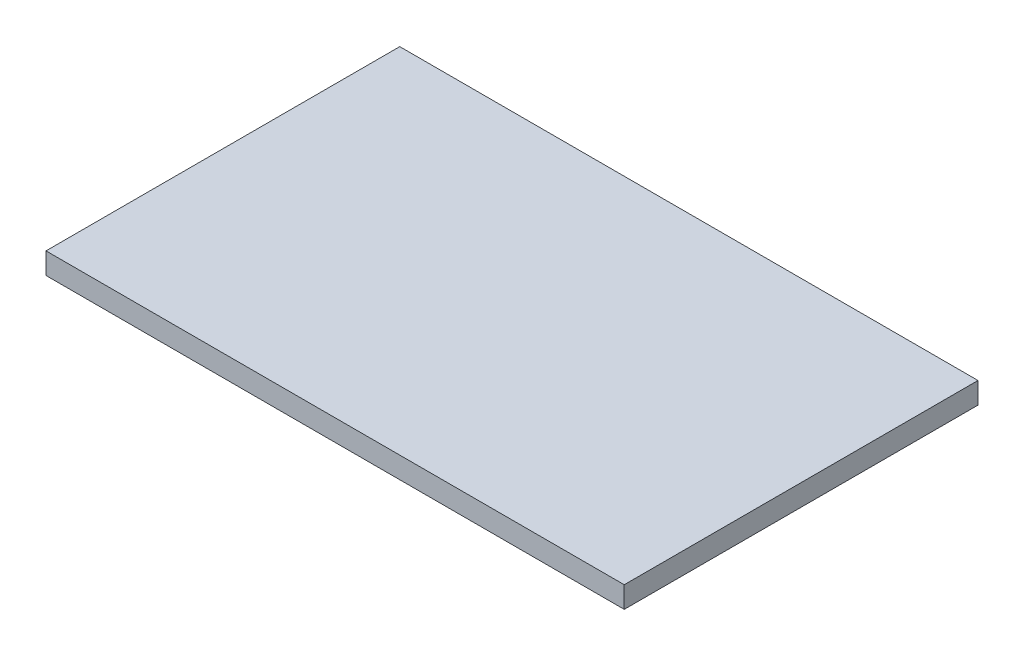
ISO-10303-21;
HEADER;
FILE_DESCRIPTION(('STEP AP214'),'2;1');
FILE_NAME('part.step','',(''),(''),'','','');
FILE_SCHEMA(('AUTOMOTIVE_DESIGN { 1 0 10303 214 1 1 1 1 }'));
ENDSEC;
DATA;
#1=APPLICATION_CONTEXT('core data for automotive mechanical design processes');
#2=APPLICATION_PROTOCOL_DEFINITION('international standard','automotive_design',2000,#1);
#3=PRODUCT_CONTEXT('',#1,'mechanical');
#4=PRODUCT('Part','Part','',(#3));
#5=PRODUCT_RELATED_PRODUCT_CATEGORY('part','',(#4));
#6=PRODUCT_DEFINITION_FORMATION('','',#4);
#7=PRODUCT_DEFINITION_CONTEXT('part definition',#1,'design');
#8=PRODUCT_DEFINITION('design','',#6,#7);
#9=PRODUCT_DEFINITION_SHAPE('','',#8);
#10=(LENGTH_UNIT() NAMED_UNIT(*) SI_UNIT(.MILLI.,.METRE.));
#11=(NAMED_UNIT(*) PLANE_ANGLE_UNIT() SI_UNIT($,.RADIAN.));
#12=(NAMED_UNIT(*) SI_UNIT($,.STERADIAN.) SOLID_ANGLE_UNIT());
#13=UNCERTAINTY_MEASURE_WITH_UNIT(LENGTH_MEASURE(1.E-05),#10,'distance_accuracy_value','');
#14=(GEOMETRIC_REPRESENTATION_CONTEXT(3) GLOBAL_UNCERTAINTY_ASSIGNED_CONTEXT((#13)) GLOBAL_UNIT_ASSIGNED_CONTEXT((#10,
#11,#12)) REPRESENTATION_CONTEXT('',''));
#15=CARTESIAN_POINT('',(0.,0.,0.));
#16=DIRECTION('',(0.,0.,1.));
#17=DIRECTION('',(1.,0.,0.));
#18=AXIS2_PLACEMENT_3D('',#15,#16,#17);
#19=CARTESIAN_POINT('',(-160.886902,11.8872,-98.425));
#20=DIRECTION('',(1.,0.,0.));
#21=DIRECTION('',(0.,0.,-1.));
#22=AXIS2_PLACEMENT_3D('',#19,#20,#21);
#23=PLANE('',#22);
#24=DIRECTION('',(0.,0.,1.));
#25=VECTOR('',#24,1.);
#26=CARTESIAN_POINT('',(-160.886902,0.,-98.425));
#27=LINE('',#26,#25);
#28=CARTESIAN_POINT('',(-160.886902,0.,-98.425));
#29=VERTEX_POINT('',#28);
#30=CARTESIAN_POINT('',(-160.886902,0.,98.425));
#31=VERTEX_POINT('',#30);
#32=EDGE_CURVE('E112',#29,#31,#27,.T.);
#33=ORIENTED_EDGE('',*,*,#32,.T.);
#34=DIRECTION('',(0.,-1.,0.));
#35=VECTOR('',#34,1.);
#36=CARTESIAN_POINT('',(-160.886902,11.8872,98.425));
#37=LINE('',#36,#35);
#38=CARTESIAN_POINT('',(-160.886902,11.8872,98.425));
#39=VERTEX_POINT('',#38);
#40=EDGE_CURVE('E11',#39,#31,#37,.T.);
#41=ORIENTED_EDGE('',*,*,#40,.F.);
#42=DIRECTION('',(0.,0.,1.));
#43=VECTOR('',#42,1.);
#44=CARTESIAN_POINT('',(-160.886902,11.8872,-98.425));
#45=LINE('',#44,#43);
#46=CARTESIAN_POINT('',(-160.886902,11.8872,-98.425));
#47=VERTEX_POINT('',#46);
#48=EDGE_CURVE('E96',#47,#39,#45,.T.);
#49=ORIENTED_EDGE('',*,*,#48,.F.);
#50=DIRECTION('',(0.,-1.,0.));
#51=VECTOR('',#50,1.);
#52=CARTESIAN_POINT('',(-160.886902,11.8872,-98.425));
#53=LINE('',#52,#51);
#54=EDGE_CURVE('E108',#47,#29,#53,.T.);
#55=ORIENTED_EDGE('',*,*,#54,.T.);
#56=EDGE_LOOP('',(#33,#41,#49,#55));
#57=FACE_BOUND('',#56,.T.);
#58=ADVANCED_FACE('F39',(#57),#23,.F.);
#59=CARTESIAN_POINT('',(160.886902,11.8872,98.425));
#60=DIRECTION('',(0.,0.,-1.));
#61=DIRECTION('',(-1.,0.,0.));
#62=AXIS2_PLACEMENT_3D('',#59,#60,#61);
#63=PLANE('',#62);
#64=DIRECTION('',(1.,0.,0.));
#65=VECTOR('',#64,1.);
#66=CARTESIAN_POINT('',(160.886902,0.,98.425));
#67=LINE('',#66,#65);
#68=CARTESIAN_POINT('',(160.886902,0.,98.425));
#69=VERTEX_POINT('',#68);
#70=EDGE_CURVE('E101',#31,#69,#67,.T.);
#71=ORIENTED_EDGE('',*,*,#70,.T.);
#72=DIRECTION('',(0.,-1.,0.));
#73=VECTOR('',#72,1.);
#74=CARTESIAN_POINT('',(160.886902,11.8872,98.425));
#75=LINE('',#74,#73);
#76=CARTESIAN_POINT('',(160.886902,11.8872,98.425));
#77=VERTEX_POINT('',#76);
#78=EDGE_CURVE('E48',#77,#69,#75,.T.);
#79=ORIENTED_EDGE('',*,*,#78,.F.);
#80=DIRECTION('',(1.,0.,0.));
#81=VECTOR('',#80,1.);
#82=CARTESIAN_POINT('',(160.886902,11.8872,98.425));
#83=LINE('',#82,#81);
#84=EDGE_CURVE('E91',#39,#77,#83,.T.);
#85=ORIENTED_EDGE('',*,*,#84,.F.);
#86=ORIENTED_EDGE('',*,*,#40,.T.);
#87=EDGE_LOOP('',(#71,#79,#85,#86));
#88=FACE_BOUND('',#87,.T.);
#89=ADVANCED_FACE('F100',(#88),#63,.F.);
#90=CARTESIAN_POINT('',(160.886902,11.8872,-98.425));
#91=DIRECTION('',(-1.,0.,0.));
#92=DIRECTION('',(0.,0.,1.));
#93=AXIS2_PLACEMENT_3D('',#90,#91,#92);
#94=PLANE('',#93);
#95=DIRECTION('',(0.,0.,-1.));
#96=VECTOR('',#95,1.);
#97=CARTESIAN_POINT('',(160.886902,0.,-98.425));
#98=LINE('',#97,#96);
#99=CARTESIAN_POINT('',(160.886902,0.,-98.425));
#100=VERTEX_POINT('',#99);
#101=EDGE_CURVE('E78',#69,#100,#98,.T.);
#102=ORIENTED_EDGE('',*,*,#101,.T.);
#103=DIRECTION('',(0.,-1.,0.));
#104=VECTOR('',#103,1.);
#105=CARTESIAN_POINT('',(160.886902,11.8872,-98.425));
#106=LINE('',#105,#104);
#107=CARTESIAN_POINT('',(160.886902,11.8872,-98.425));
#108=VERTEX_POINT('',#107);
#109=EDGE_CURVE('E102',#108,#100,#106,.T.);
#110=ORIENTED_EDGE('',*,*,#109,.F.);
#111=DIRECTION('',(0.,0.,-1.));
#112=VECTOR('',#111,1.);
#113=CARTESIAN_POINT('',(160.886902,11.8872,-98.425));
#114=LINE('',#113,#112);
#115=EDGE_CURVE('E94',#77,#108,#114,.T.);
#116=ORIENTED_EDGE('',*,*,#115,.F.);
#117=ORIENTED_EDGE('',*,*,#78,.T.);
#118=EDGE_LOOP('',(#102,#110,#116,#117));
#119=FACE_BOUND('',#118,.T.);
#120=ADVANCED_FACE('F103',(#119),#94,.F.);
#121=CARTESIAN_POINT('',(160.886902,11.8872,-98.425));
#122=DIRECTION('',(0.,0.,1.));
#123=DIRECTION('',(1.,0.,0.));
#124=AXIS2_PLACEMENT_3D('',#121,#122,#123);
#125=PLANE('',#124);
#126=DIRECTION('',(-1.,0.,0.));
#127=VECTOR('',#126,1.);
#128=CARTESIAN_POINT('',(160.886902,0.,-98.425));
#129=LINE('',#128,#127);
#130=EDGE_CURVE('E84',#100,#29,#129,.T.);
#131=ORIENTED_EDGE('',*,*,#130,.T.);
#132=ORIENTED_EDGE('',*,*,#54,.F.);
#133=DIRECTION('',(-1.,0.,0.));
#134=VECTOR('',#133,1.);
#135=CARTESIAN_POINT('',(160.886902,11.8872,-98.425));
#136=LINE('',#135,#134);
#137=EDGE_CURVE('E59',#108,#47,#136,.T.);
#138=ORIENTED_EDGE('',*,*,#137,.F.);
#139=ORIENTED_EDGE('',*,*,#109,.T.);
#140=EDGE_LOOP('',(#131,#132,#138,#139));
#141=FACE_BOUND('',#140,.T.);
#142=ADVANCED_FACE('F124',(#141),#125,.F.);
#143=CARTESIAN_POINT('',(0.,11.8872,0.));
#144=DIRECTION('',(0.,-1.,0.));
#145=DIRECTION('',(0.,0.,-1.));
#146=AXIS2_PLACEMENT_3D('',#143,#144,#145);
#147=PLANE('',#146);
#148=ORIENTED_EDGE('',*,*,#48,.T.);
#149=ORIENTED_EDGE('',*,*,#84,.T.);
#150=ORIENTED_EDGE('',*,*,#115,.T.);
#151=ORIENTED_EDGE('',*,*,#137,.T.);
#152=EDGE_LOOP('',(#148,#149,#150,#151));
#153=FACE_BOUND('',#152,.T.);
#154=ADVANCED_FACE('F92',(#153),#147,.F.);
#155=CARTESIAN_POINT('',(0.,0.,0.));
#156=DIRECTION('',(0.,-1.,0.));
#157=DIRECTION('',(0.,0.,-1.));
#158=AXIS2_PLACEMENT_3D('',#155,#156,#157);
#159=PLANE('',#158);
#160=ORIENTED_EDGE('',*,*,#32,.F.);
#161=ORIENTED_EDGE('',*,*,#130,.F.);
#162=ORIENTED_EDGE('',*,*,#101,.F.);
#163=ORIENTED_EDGE('',*,*,#70,.F.);
#164=EDGE_LOOP('',(#160,#161,#162,#163));
#165=FACE_BOUND('',#164,.T.);
#166=ADVANCED_FACE('F127',(#165),#159,.T.);
#167=CLOSED_SHELL('',(#58,#89,#120,#142,#154,#166));
#168=MANIFOLD_SOLID_BREP('B2',#167);
#169=ADVANCED_BREP_SHAPE_REPRESENTATION('',(#18,#168),#14);
#170=SHAPE_DEFINITION_REPRESENTATION(#9,#169);
ENDSEC;
END-ISO-10303-21;
